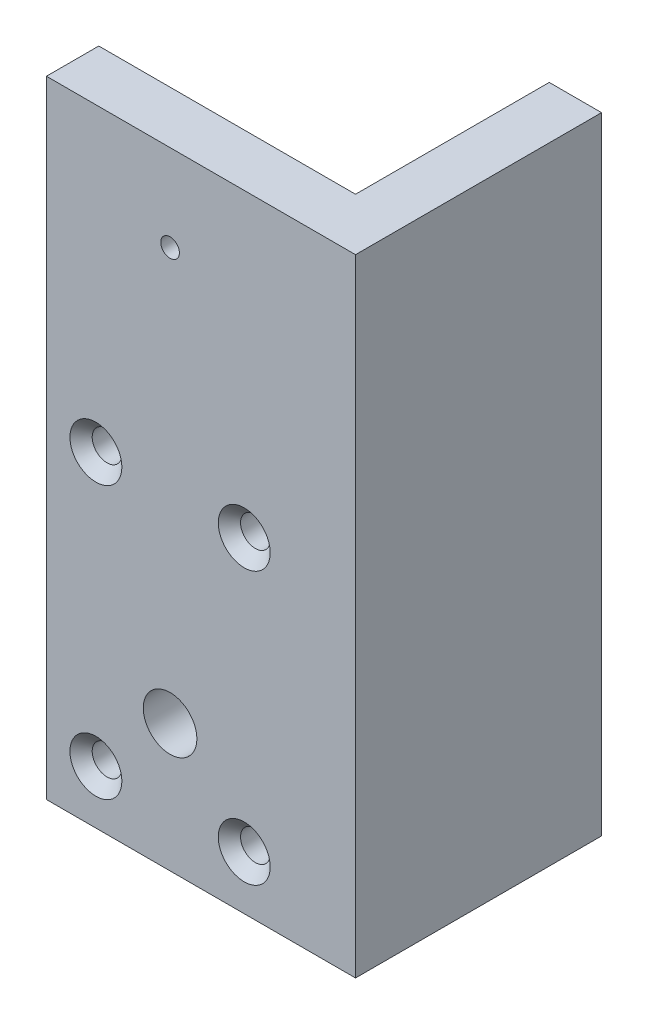
ISO-10303-21;
HEADER;
FILE_DESCRIPTION(('STEP AP214'),'2;1');
FILE_NAME('part.step','',(''),(''),'','','');
FILE_SCHEMA(('AUTOMOTIVE_DESIGN { 1 0 10303 214 1 1 1 1 }'));
ENDSEC;
DATA;
#1=APPLICATION_CONTEXT('core data for automotive mechanical design processes');
#2=APPLICATION_PROTOCOL_DEFINITION('international standard','automotive_design',2000,#1);
#3=PRODUCT_CONTEXT('',#1,'mechanical');
#4=PRODUCT('Part','Part','',(#3));
#5=PRODUCT_RELATED_PRODUCT_CATEGORY('part','',(#4));
#6=PRODUCT_DEFINITION_FORMATION('','',#4);
#7=PRODUCT_DEFINITION_CONTEXT('part definition',#1,'design');
#8=PRODUCT_DEFINITION('design','',#6,#7);
#9=PRODUCT_DEFINITION_SHAPE('','',#8);
#10=(LENGTH_UNIT() NAMED_UNIT(*) SI_UNIT(.MILLI.,.METRE.));
#11=(NAMED_UNIT(*) PLANE_ANGLE_UNIT() SI_UNIT($,.RADIAN.));
#12=(NAMED_UNIT(*) SI_UNIT($,.STERADIAN.) SOLID_ANGLE_UNIT());
#13=UNCERTAINTY_MEASURE_WITH_UNIT(LENGTH_MEASURE(1.E-05),#10,'distance_accuracy_value','');
#14=(GEOMETRIC_REPRESENTATION_CONTEXT(3) GLOBAL_UNCERTAINTY_ASSIGNED_CONTEXT((#13)) GLOBAL_UNIT_ASSIGNED_CONTEXT((#10,
#11,#12)) REPRESENTATION_CONTEXT('',''));
#15=CARTESIAN_POINT('',(0.,0.,0.));
#16=DIRECTION('',(0.,0.,1.));
#17=DIRECTION('',(1.,0.,0.));
#18=AXIS2_PLACEMENT_3D('',#15,#16,#17);
#19=CARTESIAN_POINT('',(0.,0.,0.));
#20=DIRECTION('',(0.,0.,1.));
#21=DIRECTION('',(1.,0.,0.));
#22=AXIS2_PLACEMENT_3D('',#19,#20,#21);
#23=PLANE('',#22);
#24=CARTESIAN_POINT('',(15.,65.5,0.));
#25=DIRECTION('',(0.,0.,1.));
#26=DIRECTION('',(1.,0.,0.));
#27=AXIS2_PLACEMENT_3D('',#24,#25,#26);
#28=CIRCLE('',#27,1.1303);
#29=CARTESIAN_POINT('',(16.1303,65.5,0.));
#30=VERTEX_POINT('',#29);
#31=EDGE_CURVE('E120',#30,#30,#28,.F.);
#32=ORIENTED_EDGE('',*,*,#31,.F.);
#33=EDGE_LOOP('',(#32));
#34=FACE_BOUND('',#33,.T.);
#35=CARTESIAN_POINT('',(15.,15.5,0.));
#36=DIRECTION('',(0.,0.,1.));
#37=DIRECTION('',(1.,0.,0.));
#38=AXIS2_PLACEMENT_3D('',#35,#36,#37);
#39=CIRCLE('',#38,3.25);
#40=CARTESIAN_POINT('',(18.25,15.5,0.));
#41=VERTEX_POINT('',#40);
#42=EDGE_CURVE('E180',#41,#41,#39,.T.);
#43=ORIENTED_EDGE('',*,*,#42,.T.);
#44=EDGE_LOOP('',(#43));
#45=FACE_BOUND('',#44,.T.);
#46=CARTESIAN_POINT('',(24.,6.5,0.));
#47=DIRECTION('',(0.,0.,1.));
#48=DIRECTION('',(1.,0.,0.));
#49=AXIS2_PLACEMENT_3D('',#46,#47,#48);
#50=CIRCLE('',#49,1.8);
#51=CARTESIAN_POINT('',(25.8,6.5,0.));
#52=VERTEX_POINT('',#51);
#53=EDGE_CURVE('E172',#52,#52,#50,.T.);
#54=ORIENTED_EDGE('',*,*,#53,.T.);
#55=EDGE_LOOP('',(#54));
#56=FACE_BOUND('',#55,.T.);
#57=CARTESIAN_POINT('',(24.,39.5,0.));
#58=DIRECTION('',(0.,0.,1.));
#59=DIRECTION('',(1.,0.,0.));
#60=AXIS2_PLACEMENT_3D('',#57,#58,#59);
#61=CIRCLE('',#60,1.8);
#62=CARTESIAN_POINT('',(25.8,39.5,0.));
#63=VERTEX_POINT('',#62);
#64=EDGE_CURVE('E163',#63,#63,#61,.T.);
#65=ORIENTED_EDGE('',*,*,#64,.T.);
#66=EDGE_LOOP('',(#65));
#67=FACE_BOUND('',#66,.T.);
#68=CARTESIAN_POINT('',(6.,39.5,0.));
#69=DIRECTION('',(0.,0.,1.));
#70=DIRECTION('',(1.,0.,0.));
#71=AXIS2_PLACEMENT_3D('',#68,#69,#70);
#72=CIRCLE('',#71,1.8);
#73=CARTESIAN_POINT('',(7.8,39.5,0.));
#74=VERTEX_POINT('',#73);
#75=EDGE_CURVE('E154',#74,#74,#72,.T.);
#76=ORIENTED_EDGE('',*,*,#75,.T.);
#77=EDGE_LOOP('',(#76));
#78=FACE_BOUND('',#77,.T.);
#79=CARTESIAN_POINT('',(6.,6.5,0.));
#80=DIRECTION('',(0.,0.,1.));
#81=DIRECTION('',(1.,0.,0.));
#82=AXIS2_PLACEMENT_3D('',#79,#80,#81);
#83=CIRCLE('',#82,1.8);
#84=CARTESIAN_POINT('',(7.8,6.5,0.));
#85=VERTEX_POINT('',#84);
#86=EDGE_CURVE('E145',#85,#85,#83,.T.);
#87=ORIENTED_EDGE('',*,*,#86,.T.);
#88=EDGE_LOOP('',(#87));
#89=FACE_BOUND('',#88,.T.);
#90=DIRECTION('',(0.,1.,0.));
#91=VECTOR('',#90,1.);
#92=CARTESIAN_POINT('',(31.15,0.,0.));
#93=LINE('',#92,#91);
#94=CARTESIAN_POINT('',(31.15,0.,0.));
#95=VERTEX_POINT('',#94);
#96=CARTESIAN_POINT('',(31.15,76.,0.));
#97=VERTEX_POINT('',#96);
#98=EDGE_CURVE('E57',#95,#97,#93,.T.);
#99=ORIENTED_EDGE('',*,*,#98,.F.);
#100=DIRECTION('',(1.,0.,0.));
#101=VECTOR('',#100,1.);
#102=CARTESIAN_POINT('',(0.,0.,0.));
#103=LINE('',#102,#101);
#104=CARTESIAN_POINT('',(0.,0.,0.));
#105=VERTEX_POINT('',#104);
#106=EDGE_CURVE('E175',#105,#95,#103,.T.);
#107=ORIENTED_EDGE('',*,*,#106,.F.);
#108=DIRECTION('',(0.,1.,0.));
#109=VECTOR('',#108,1.);
#110=CARTESIAN_POINT('',(0.,0.,0.));
#111=LINE('',#110,#109);
#112=CARTESIAN_POINT('',(0.,76.,0.));
#113=VERTEX_POINT('',#112);
#114=EDGE_CURVE('E110',#105,#113,#111,.T.);
#115=ORIENTED_EDGE('',*,*,#114,.T.);
#116=DIRECTION('',(-1.,0.,0.));
#117=VECTOR('',#116,1.);
#118=CARTESIAN_POINT('',(31.15,76.,0.));
#119=LINE('',#118,#117);
#120=EDGE_CURVE('E109',#97,#113,#119,.T.);
#121=ORIENTED_EDGE('',*,*,#120,.F.);
#122=EDGE_LOOP('',(#99,#107,#115,#121));
#123=FACE_BOUND('',#122,.T.);
#124=ADVANCED_FACE('F42',(#34,#45,#56,#67,#78,#89,#123),#23,.F.);
#125=CARTESIAN_POINT('',(0.,0.,6.35));
#126=DIRECTION('',(0.,1.,0.));
#127=DIRECTION('',(-1.,0.,0.));
#128=AXIS2_PLACEMENT_3D('',#125,#126,#127);
#129=PLANE('',#128);
#130=ORIENTED_EDGE('',*,*,#106,.T.);
#131=DIRECTION('',(0.,0.,1.));
#132=VECTOR('',#131,1.);
#133=CARTESIAN_POINT('',(31.15,0.,-23.5));
#134=LINE('',#133,#132);
#135=CARTESIAN_POINT('',(31.15,0.,-23.5));
#136=VERTEX_POINT('',#135);
#137=EDGE_CURVE('E104',#136,#95,#134,.T.);
#138=ORIENTED_EDGE('',*,*,#137,.F.);
#139=DIRECTION('',(-1.,0.,0.));
#140=VECTOR('',#139,1.);
#141=CARTESIAN_POINT('',(37.5,0.,-23.5));
#142=LINE('',#141,#140);
#143=CARTESIAN_POINT('',(37.5,0.,-23.5));
#144=VERTEX_POINT('',#143);
#145=EDGE_CURVE('E79',#144,#136,#142,.T.);
#146=ORIENTED_EDGE('',*,*,#145,.F.);
#147=DIRECTION('',(0.,0.,-1.));
#148=VECTOR('',#147,1.);
#149=CARTESIAN_POINT('',(37.5,0.,6.35));
#150=LINE('',#149,#148);
#151=CARTESIAN_POINT('',(37.5,0.,6.35));
#152=VERTEX_POINT('',#151);
#153=EDGE_CURVE('E11',#152,#144,#150,.T.);
#154=ORIENTED_EDGE('',*,*,#153,.F.);
#155=DIRECTION('',(1.,0.,0.));
#156=VECTOR('',#155,1.);
#157=CARTESIAN_POINT('',(0.,0.,6.35));
#158=LINE('',#157,#156);
#159=CARTESIAN_POINT('',(0.,0.,6.35));
#160=VERTEX_POINT('',#159);
#161=EDGE_CURVE('E176',#160,#152,#158,.T.);
#162=ORIENTED_EDGE('',*,*,#161,.F.);
#163=DIRECTION('',(0.,0.,-1.));
#164=VECTOR('',#163,1.);
#165=CARTESIAN_POINT('',(0.,0.,6.35));
#166=LINE('',#165,#164);
#167=EDGE_CURVE('E50',#160,#105,#166,.T.);
#168=ORIENTED_EDGE('',*,*,#167,.T.);
#169=EDGE_LOOP('',(#130,#138,#146,#154,#162,#168));
#170=FACE_BOUND('',#169,.T.);
#171=ADVANCED_FACE('F44',(#170),#129,.F.);
#172=CARTESIAN_POINT('',(37.5,0.,6.35));
#173=DIRECTION('',(-1.,0.,0.));
#174=DIRECTION('',(0.,0.,1.));
#175=AXIS2_PLACEMENT_3D('',#172,#173,#174);
#176=PLANE('',#175);
#177=ORIENTED_EDGE('',*,*,#153,.T.);
#178=DIRECTION('',(0.,-1.,0.));
#179=VECTOR('',#178,1.);
#180=CARTESIAN_POINT('',(37.5,0.,-23.5));
#181=LINE('',#180,#179);
#182=CARTESIAN_POINT('',(37.5,76.,-23.5));
#183=VERTEX_POINT('',#182);
#184=EDGE_CURVE('E105',#183,#144,#181,.T.);
#185=ORIENTED_EDGE('',*,*,#184,.F.);
#186=DIRECTION('',(0.,0.,-1.));
#187=VECTOR('',#186,1.);
#188=CARTESIAN_POINT('',(37.5,76.,6.35));
#189=LINE('',#188,#187);
#190=CARTESIAN_POINT('',(37.5,76.,6.35));
#191=VERTEX_POINT('',#190);
#192=EDGE_CURVE('E131',#191,#183,#189,.T.);
#193=ORIENTED_EDGE('',*,*,#192,.F.);
#194=DIRECTION('',(0.,1.,0.));
#195=VECTOR('',#194,1.);
#196=CARTESIAN_POINT('',(37.5,0.,6.35));
#197=LINE('',#196,#195);
#198=EDGE_CURVE('E179',#152,#191,#197,.T.);
#199=ORIENTED_EDGE('',*,*,#198,.F.);
#200=EDGE_LOOP('',(#177,#185,#193,#199));
#201=FACE_BOUND('',#200,.T.);
#202=ADVANCED_FACE('F208',(#201),#176,.F.);
#203=CARTESIAN_POINT('',(0.,0.,6.35));
#204=DIRECTION('',(-1.,0.,0.));
#205=DIRECTION('',(0.,-1.,0.));
#206=AXIS2_PLACEMENT_3D('',#203,#204,#205);
#207=PLANE('',#206);
#208=ORIENTED_EDGE('',*,*,#114,.F.);
#209=ORIENTED_EDGE('',*,*,#167,.F.);
#210=DIRECTION('',(0.,1.,0.));
#211=VECTOR('',#210,1.);
#212=CARTESIAN_POINT('',(0.,0.,6.35));
#213=LINE('',#212,#211);
#214=CARTESIAN_POINT('',(0.,76.,6.35));
#215=VERTEX_POINT('',#214);
#216=EDGE_CURVE('E182',#160,#215,#213,.T.);
#217=ORIENTED_EDGE('',*,*,#216,.T.);
#218=DIRECTION('',(0.,0.,1.));
#219=VECTOR('',#218,1.);
#220=CARTESIAN_POINT('',(0.,76.,0.));
#221=LINE('',#220,#219);
#222=EDGE_CURVE('E114',#113,#215,#221,.T.);
#223=ORIENTED_EDGE('',*,*,#222,.F.);
#224=EDGE_LOOP('',(#208,#209,#217,#223));
#225=FACE_BOUND('',#224,.T.);
#226=ADVANCED_FACE('F197',(#225),#207,.T.);
#227=CARTESIAN_POINT('',(15.,15.5,6.35));
#228=DIRECTION('',(0.,0.,-1.));
#229=DIRECTION('',(-1.,0.,0.));
#230=AXIS2_PLACEMENT_3D('',#227,#228,#229);
#231=CYLINDRICAL_SURFACE('',#230,3.25);
#232=CARTESIAN_POINT('',(15.,15.5,6.35));
#233=DIRECTION('',(0.,0.,1.));
#234=DIRECTION('',(1.,0.,0.));
#235=AXIS2_PLACEMENT_3D('',#232,#233,#234);
#236=CIRCLE('',#235,3.25);
#237=CARTESIAN_POINT('',(18.25,15.5,6.35));
#238=VERTEX_POINT('',#237);
#239=EDGE_CURVE('E184',#238,#238,#236,.T.);
#240=ORIENTED_EDGE('',*,*,#239,.T.);
#241=EDGE_LOOP('',(#240));
#242=FACE_BOUND('',#241,.T.);
#243=ORIENTED_EDGE('',*,*,#42,.F.);
#244=EDGE_LOOP('',(#243));
#245=FACE_BOUND('',#244,.T.);
#246=ADVANCED_FACE('F194',(#242,#245),#231,.F.);
#247=CARTESIAN_POINT('',(0.,0.,6.35));
#248=DIRECTION('',(0.,0.,1.));
#249=DIRECTION('',(1.,0.,0.));
#250=AXIS2_PLACEMENT_3D('',#247,#248,#249);
#251=PLANE('',#250);
#252=CARTESIAN_POINT('',(15.,65.5,6.35));
#253=DIRECTION('',(0.,0.,1.));
#254=DIRECTION('',(1.,0.,0.));
#255=AXIS2_PLACEMENT_3D('',#252,#253,#254);
#256=CIRCLE('',#255,1.1303);
#257=CARTESIAN_POINT('',(16.1303,65.5,6.35));
#258=VERTEX_POINT('',#257);
#259=EDGE_CURVE('E123',#258,#258,#256,.T.);
#260=ORIENTED_EDGE('',*,*,#259,.F.);
#261=EDGE_LOOP('',(#260));
#262=FACE_BOUND('',#261,.T.);
#263=CARTESIAN_POINT('',(6.,6.5,6.35));
#264=DIRECTION('',(0.,0.,1.));
#265=DIRECTION('',(1.,0.,0.));
#266=AXIS2_PLACEMENT_3D('',#263,#264,#265);
#267=CIRCLE('',#266,3.15);
#268=CARTESIAN_POINT('',(9.15,6.5,6.35));
#269=VERTEX_POINT('',#268);
#270=EDGE_CURVE('E139',#269,#269,#267,.T.);
#271=ORIENTED_EDGE('',*,*,#270,.F.);
#272=EDGE_LOOP('',(#271));
#273=FACE_BOUND('',#272,.T.);
#274=CARTESIAN_POINT('',(6.,39.5,6.35));
#275=DIRECTION('',(0.,0.,1.));
#276=DIRECTION('',(1.,0.,0.));
#277=AXIS2_PLACEMENT_3D('',#274,#275,#276);
#278=CIRCLE('',#277,3.15);
#279=CARTESIAN_POINT('',(9.15,39.5,6.35));
#280=VERTEX_POINT('',#279);
#281=EDGE_CURVE('E148',#280,#280,#278,.T.);
#282=ORIENTED_EDGE('',*,*,#281,.F.);
#283=EDGE_LOOP('',(#282));
#284=FACE_BOUND('',#283,.T.);
#285=CARTESIAN_POINT('',(24.,39.5,6.35));
#286=DIRECTION('',(0.,0.,1.));
#287=DIRECTION('',(1.,0.,0.));
#288=AXIS2_PLACEMENT_3D('',#285,#286,#287);
#289=CIRCLE('',#288,3.15);
#290=CARTESIAN_POINT('',(27.15,39.5,6.35));
#291=VERTEX_POINT('',#290);
#292=EDGE_CURVE('E157',#291,#291,#289,.T.);
#293=ORIENTED_EDGE('',*,*,#292,.F.);
#294=EDGE_LOOP('',(#293));
#295=FACE_BOUND('',#294,.T.);
#296=CARTESIAN_POINT('',(24.,6.5,6.35));
#297=DIRECTION('',(0.,0.,1.));
#298=DIRECTION('',(1.,0.,0.));
#299=AXIS2_PLACEMENT_3D('',#296,#297,#298);
#300=CIRCLE('',#299,3.15);
#301=CARTESIAN_POINT('',(27.15,6.5,6.35));
#302=VERTEX_POINT('',#301);
#303=EDGE_CURVE('E166',#302,#302,#300,.T.);
#304=ORIENTED_EDGE('',*,*,#303,.F.);
#305=EDGE_LOOP('',(#304));
#306=FACE_BOUND('',#305,.T.);
#307=ORIENTED_EDGE('',*,*,#161,.T.);
#308=ORIENTED_EDGE('',*,*,#198,.T.);
#309=DIRECTION('',(1.,0.,0.));
#310=VECTOR('',#309,1.);
#311=CARTESIAN_POINT('',(0.,76.,6.35));
#312=LINE('',#311,#310);
#313=EDGE_CURVE('E128',#215,#191,#312,.T.);
#314=ORIENTED_EDGE('',*,*,#313,.F.);
#315=ORIENTED_EDGE('',*,*,#216,.F.);
#316=EDGE_LOOP('',(#307,#308,#314,#315));
#317=FACE_BOUND('',#316,.T.);
#318=ORIENTED_EDGE('',*,*,#239,.F.);
#319=EDGE_LOOP('',(#318));
#320=FACE_BOUND('',#319,.T.);
#321=ADVANCED_FACE('F196',(#262,#273,#284,#295,#306,#317,#320),#251,.T.);
#322=CARTESIAN_POINT('',(24.,6.5,6.35));
#323=DIRECTION('',(0.,0.,1.));
#324=DIRECTION('',(1.,0.,0.));
#325=AXIS2_PLACEMENT_3D('',#322,#323,#324);
#326=CYLINDRICAL_SURFACE('',#325,1.8);
#327=ORIENTED_EDGE('',*,*,#53,.F.);
#328=EDGE_LOOP('',(#327));
#329=FACE_BOUND('',#328,.T.);
#330=CARTESIAN_POINT('',(24.,6.5,5.));
#331=DIRECTION('',(0.,0.,1.));
#332=DIRECTION('',(1.,0.,0.));
#333=AXIS2_PLACEMENT_3D('',#330,#331,#332);
#334=CIRCLE('',#333,1.8);
#335=CARTESIAN_POINT('',(25.8,6.5,5.));
#336=VERTEX_POINT('',#335);
#337=EDGE_CURVE('E169',#336,#336,#334,.T.);
#338=ORIENTED_EDGE('',*,*,#337,.T.);
#339=EDGE_LOOP('',(#338));
#340=FACE_BOUND('',#339,.T.);
#341=ADVANCED_FACE('F205',(#329,#340),#326,.F.);
#342=CARTESIAN_POINT('',(24.,6.5,6.35));
#343=DIRECTION('',(0.,0.,1.));
#344=DIRECTION('',(1.,0.,0.));
#345=AXIS2_PLACEMENT_3D('',#342,#343,#344);
#346=CONICAL_SURFACE('',#345,3.15,0.785398163397448);
#347=ORIENTED_EDGE('',*,*,#337,.F.);
#348=EDGE_LOOP('',(#347));
#349=FACE_BOUND('',#348,.T.);
#350=ORIENTED_EDGE('',*,*,#303,.T.);
#351=EDGE_LOOP('',(#350));
#352=FACE_BOUND('',#351,.T.);
#353=ADVANCED_FACE('F221',(#349,#352),#346,.F.);
#354=CARTESIAN_POINT('',(24.,39.5,6.35));
#355=DIRECTION('',(0.,0.,1.));
#356=DIRECTION('',(1.,0.,0.));
#357=AXIS2_PLACEMENT_3D('',#354,#355,#356);
#358=CYLINDRICAL_SURFACE('',#357,1.8);
#359=ORIENTED_EDGE('',*,*,#64,.F.);
#360=EDGE_LOOP('',(#359));
#361=FACE_BOUND('',#360,.T.);
#362=CARTESIAN_POINT('',(24.,39.5,5.));
#363=DIRECTION('',(0.,0.,1.));
#364=DIRECTION('',(1.,0.,0.));
#365=AXIS2_PLACEMENT_3D('',#362,#363,#364);
#366=CIRCLE('',#365,1.8);
#367=CARTESIAN_POINT('',(25.8,39.5,5.));
#368=VERTEX_POINT('',#367);
#369=EDGE_CURVE('E160',#368,#368,#366,.T.);
#370=ORIENTED_EDGE('',*,*,#369,.T.);
#371=EDGE_LOOP('',(#370));
#372=FACE_BOUND('',#371,.T.);
#373=ADVANCED_FACE('F225',(#361,#372),#358,.F.);
#374=CARTESIAN_POINT('',(24.,39.5,6.35));
#375=DIRECTION('',(0.,0.,1.));
#376=DIRECTION('',(1.,0.,0.));
#377=AXIS2_PLACEMENT_3D('',#374,#375,#376);
#378=CONICAL_SURFACE('',#377,3.15,0.785398163397448);
#379=ORIENTED_EDGE('',*,*,#369,.F.);
#380=EDGE_LOOP('',(#379));
#381=FACE_BOUND('',#380,.T.);
#382=ORIENTED_EDGE('',*,*,#292,.T.);
#383=EDGE_LOOP('',(#382));
#384=FACE_BOUND('',#383,.T.);
#385=ADVANCED_FACE('F229',(#381,#384),#378,.F.);
#386=CARTESIAN_POINT('',(6.,39.5,6.35));
#387=DIRECTION('',(0.,0.,1.));
#388=DIRECTION('',(1.,0.,0.));
#389=AXIS2_PLACEMENT_3D('',#386,#387,#388);
#390=CYLINDRICAL_SURFACE('',#389,1.8);
#391=ORIENTED_EDGE('',*,*,#75,.F.);
#392=EDGE_LOOP('',(#391));
#393=FACE_BOUND('',#392,.T.);
#394=CARTESIAN_POINT('',(6.,39.5,5.));
#395=DIRECTION('',(0.,0.,1.));
#396=DIRECTION('',(1.,0.,0.));
#397=AXIS2_PLACEMENT_3D('',#394,#395,#396);
#398=CIRCLE('',#397,1.8);
#399=CARTESIAN_POINT('',(7.8,39.5,5.));
#400=VERTEX_POINT('',#399);
#401=EDGE_CURVE('E151',#400,#400,#398,.T.);
#402=ORIENTED_EDGE('',*,*,#401,.T.);
#403=EDGE_LOOP('',(#402));
#404=FACE_BOUND('',#403,.T.);
#405=ADVANCED_FACE('F233',(#393,#404),#390,.F.);
#406=CARTESIAN_POINT('',(6.,39.5,6.35));
#407=DIRECTION('',(0.,0.,1.));
#408=DIRECTION('',(1.,0.,0.));
#409=AXIS2_PLACEMENT_3D('',#406,#407,#408);
#410=CONICAL_SURFACE('',#409,3.15,0.785398163397448);
#411=ORIENTED_EDGE('',*,*,#401,.F.);
#412=EDGE_LOOP('',(#411));
#413=FACE_BOUND('',#412,.T.);
#414=ORIENTED_EDGE('',*,*,#281,.T.);
#415=EDGE_LOOP('',(#414));
#416=FACE_BOUND('',#415,.T.);
#417=ADVANCED_FACE('F237',(#413,#416),#410,.F.);
#418=CARTESIAN_POINT('',(6.,6.5,6.35));
#419=DIRECTION('',(0.,0.,1.));
#420=DIRECTION('',(1.,0.,0.));
#421=AXIS2_PLACEMENT_3D('',#418,#419,#420);
#422=CYLINDRICAL_SURFACE('',#421,1.8);
#423=ORIENTED_EDGE('',*,*,#86,.F.);
#424=EDGE_LOOP('',(#423));
#425=FACE_BOUND('',#424,.T.);
#426=CARTESIAN_POINT('',(6.,6.5,5.));
#427=DIRECTION('',(0.,0.,1.));
#428=DIRECTION('',(1.,0.,0.));
#429=AXIS2_PLACEMENT_3D('',#426,#427,#428);
#430=CIRCLE('',#429,1.8);
#431=CARTESIAN_POINT('',(7.8,6.5,5.));
#432=VERTEX_POINT('',#431);
#433=EDGE_CURVE('E142',#432,#432,#430,.T.);
#434=ORIENTED_EDGE('',*,*,#433,.T.);
#435=EDGE_LOOP('',(#434));
#436=FACE_BOUND('',#435,.T.);
#437=ADVANCED_FACE('F241',(#425,#436),#422,.F.);
#438=CARTESIAN_POINT('',(6.,6.5,6.35));
#439=DIRECTION('',(0.,0.,1.));
#440=DIRECTION('',(1.,0.,0.));
#441=AXIS2_PLACEMENT_3D('',#438,#439,#440);
#442=CONICAL_SURFACE('',#441,3.15,0.785398163397448);
#443=ORIENTED_EDGE('',*,*,#433,.F.);
#444=EDGE_LOOP('',(#443));
#445=FACE_BOUND('',#444,.T.);
#446=ORIENTED_EDGE('',*,*,#270,.T.);
#447=EDGE_LOOP('',(#446));
#448=FACE_BOUND('',#447,.T.);
#449=ADVANCED_FACE('F245',(#445,#448),#442,.F.);
#450=CARTESIAN_POINT('',(31.15,0.,-23.5));
#451=DIRECTION('',(1.,0.,0.));
#452=DIRECTION('',(0.,0.,-1.));
#453=AXIS2_PLACEMENT_3D('',#450,#451,#452);
#454=PLANE('',#453);
#455=ORIENTED_EDGE('',*,*,#98,.T.);
#456=DIRECTION('',(0.,0.,1.));
#457=VECTOR('',#456,1.);
#458=CARTESIAN_POINT('',(31.15,76.,-23.5));
#459=LINE('',#458,#457);
#460=CARTESIAN_POINT('',(31.15,76.,-23.5));
#461=VERTEX_POINT('',#460);
#462=EDGE_CURVE('E103',#461,#97,#459,.T.);
#463=ORIENTED_EDGE('',*,*,#462,.F.);
#464=DIRECTION('',(0.,1.,0.));
#465=VECTOR('',#464,1.);
#466=CARTESIAN_POINT('',(31.15,0.,-23.5));
#467=LINE('',#466,#465);
#468=EDGE_CURVE('E136',#136,#461,#467,.T.);
#469=ORIENTED_EDGE('',*,*,#468,.F.);
#470=ORIENTED_EDGE('',*,*,#137,.T.);
#471=EDGE_LOOP('',(#455,#463,#469,#470));
#472=FACE_BOUND('',#471,.T.);
#473=ADVANCED_FACE('F100',(#472),#454,.F.);
#474=CARTESIAN_POINT('',(0.,0.,-23.5));
#475=DIRECTION('',(0.,0.,1.));
#476=DIRECTION('',(1.,0.,0.));
#477=AXIS2_PLACEMENT_3D('',#474,#475,#476);
#478=PLANE('',#477);
#479=CARTESIAN_POINT('',(34.325,10.,-23.5));
#480=DIRECTION('',(0.,0.,-1.));
#481=DIRECTION('',(-1.,0.,0.));
#482=AXIS2_PLACEMENT_3D('',#479,#480,#481);
#483=CIRCLE('',#482,1.3890625);
#484=CARTESIAN_POINT('',(32.9359375,10.,-23.5));
#485=VERTEX_POINT('',#484);
#486=EDGE_CURVE('E282',#485,#485,#483,.T.);
#487=ORIENTED_EDGE('',*,*,#486,.F.);
#488=EDGE_LOOP('',(#487));
#489=FACE_BOUND('',#488,.T.);
#490=CARTESIAN_POINT('',(34.325,66.,-23.5));
#491=DIRECTION('',(0.,0.,-1.));
#492=DIRECTION('',(-1.,0.,0.));
#493=AXIS2_PLACEMENT_3D('',#490,#491,#492);
#494=CIRCLE('',#493,1.3890625);
#495=CARTESIAN_POINT('',(32.9359375,66.,-23.5));
#496=VERTEX_POINT('',#495);
#497=EDGE_CURVE('E291',#496,#496,#494,.T.);
#498=ORIENTED_EDGE('',*,*,#497,.F.);
#499=EDGE_LOOP('',(#498));
#500=FACE_BOUND('',#499,.T.);
#501=ORIENTED_EDGE('',*,*,#184,.T.);
#502=ORIENTED_EDGE('',*,*,#145,.T.);
#503=ORIENTED_EDGE('',*,*,#468,.T.);
#504=DIRECTION('',(-1.,0.,0.));
#505=VECTOR('',#504,1.);
#506=CARTESIAN_POINT('',(37.5,76.,-23.5));
#507=LINE('',#506,#505);
#508=EDGE_CURVE('E106',#183,#461,#507,.T.);
#509=ORIENTED_EDGE('',*,*,#508,.F.);
#510=EDGE_LOOP('',(#501,#502,#503,#509));
#511=FACE_BOUND('',#510,.T.);
#512=ADVANCED_FACE('F252',(#489,#500,#511),#478,.F.);
#513=CARTESIAN_POINT('',(0.,76.,0.));
#514=DIRECTION('',(0.,-1.,0.));
#515=DIRECTION('',(0.,0.,-1.));
#516=AXIS2_PLACEMENT_3D('',#513,#514,#515);
#517=PLANE('',#516);
#518=ORIENTED_EDGE('',*,*,#462,.T.);
#519=ORIENTED_EDGE('',*,*,#120,.T.);
#520=ORIENTED_EDGE('',*,*,#222,.T.);
#521=ORIENTED_EDGE('',*,*,#313,.T.);
#522=ORIENTED_EDGE('',*,*,#192,.T.);
#523=ORIENTED_EDGE('',*,*,#508,.T.);
#524=EDGE_LOOP('',(#518,#519,#520,#521,#522,#523));
#525=FACE_BOUND('',#524,.T.);
#526=ADVANCED_FACE('F117',(#525),#517,.F.);
#527=CARTESIAN_POINT('',(15.,65.5,-23.501));
#528=DIRECTION('',(0.,0.,1.));
#529=DIRECTION('',(1.,0.,0.));
#530=AXIS2_PLACEMENT_3D('',#527,#528,#529);
#531=CYLINDRICAL_SURFACE('',#530,1.1303);
#532=ORIENTED_EDGE('',*,*,#259,.T.);
#533=EDGE_LOOP('',(#532));
#534=FACE_BOUND('',#533,.T.);
#535=ORIENTED_EDGE('',*,*,#31,.T.);
#536=EDGE_LOOP('',(#535));
#537=FACE_BOUND('',#536,.T.);
#538=ADVANCED_FACE('F258',(#534,#537),#531,.F.);
#539=CARTESIAN_POINT('',(34.325,66.,-13.5));
#540=DIRECTION('',(0.,0.,-1.));
#541=DIRECTION('',(-1.,0.,0.));
#542=AXIS2_PLACEMENT_3D('',#539,#540,#541);
#543=CYLINDRICAL_SURFACE('',#542,1.3890625);
#544=CARTESIAN_POINT('',(34.325,66.,-13.5));
#545=DIRECTION('',(0.,0.,-1.));
#546=DIRECTION('',(-1.,0.,0.));
#547=AXIS2_PLACEMENT_3D('',#544,#545,#546);
#548=CIRCLE('',#547,1.3890625);
#549=CARTESIAN_POINT('',(32.9359375,66.,-13.5));
#550=VERTEX_POINT('',#549);
#551=EDGE_CURVE('E286',#550,#550,#548,.T.);
#552=ORIENTED_EDGE('',*,*,#551,.F.);
#553=EDGE_LOOP('',(#552));
#554=FACE_BOUND('',#553,.T.);
#555=ORIENTED_EDGE('',*,*,#497,.T.);
#556=EDGE_LOOP('',(#555));
#557=FACE_BOUND('',#556,.T.);
#558=ADVANCED_FACE('F261',(#554,#557),#543,.F.);
#559=CARTESIAN_POINT('',(34.325,66.,-13.5));
#560=DIRECTION('',(0.,0.,-1.));
#561=DIRECTION('',(-1.,0.,0.));
#562=AXIS2_PLACEMENT_3D('',#559,#560,#561);
#563=PLANE('',#562);
#564=ORIENTED_EDGE('',*,*,#551,.T.);
#565=EDGE_LOOP('',(#564));
#566=FACE_BOUND('',#565,.T.);
#567=ADVANCED_FACE('F265',(#566),#563,.T.);
#568=CARTESIAN_POINT('',(34.325,10.,-13.5));
#569=DIRECTION('',(0.,0.,-1.));
#570=DIRECTION('',(-1.,0.,0.));
#571=AXIS2_PLACEMENT_3D('',#568,#569,#570);
#572=CYLINDRICAL_SURFACE('',#571,1.3890625);
#573=CARTESIAN_POINT('',(34.325,10.,-13.5));
#574=DIRECTION('',(0.,0.,-1.));
#575=DIRECTION('',(-1.,0.,0.));
#576=AXIS2_PLACEMENT_3D('',#573,#574,#575);
#577=CIRCLE('',#576,1.3890625);
#578=CARTESIAN_POINT('',(32.9359375,10.,-13.5));
#579=VERTEX_POINT('',#578);
#580=EDGE_CURVE('E281',#579,#579,#577,.T.);
#581=ORIENTED_EDGE('',*,*,#580,.F.);
#582=EDGE_LOOP('',(#581));
#583=FACE_BOUND('',#582,.T.);
#584=ORIENTED_EDGE('',*,*,#486,.T.);
#585=EDGE_LOOP('',(#584));
#586=FACE_BOUND('',#585,.T.);
#587=ADVANCED_FACE('F269',(#583,#586),#572,.F.);
#588=CARTESIAN_POINT('',(34.325,10.,-13.5));
#589=DIRECTION('',(0.,0.,-1.));
#590=DIRECTION('',(-1.,0.,0.));
#591=AXIS2_PLACEMENT_3D('',#588,#589,#590);
#592=PLANE('',#591);
#593=ORIENTED_EDGE('',*,*,#580,.T.);
#594=EDGE_LOOP('',(#593));
#595=FACE_BOUND('',#594,.T.);
#596=ADVANCED_FACE('F273',(#595),#592,.T.);
#597=CLOSED_SHELL('',(#124,#171,#202,#226,#246,#321,#341,#353,#373,#385,#405,#417,#437,#449,
#473,#512,#526,#538,#558,#567,#587,#596));
#598=MANIFOLD_SOLID_BREP('B2',#597);
#599=ADVANCED_BREP_SHAPE_REPRESENTATION('',(#18,#598),#14);
#600=SHAPE_DEFINITION_REPRESENTATION(#9,#599);
ENDSEC;
END-ISO-10303-21;
